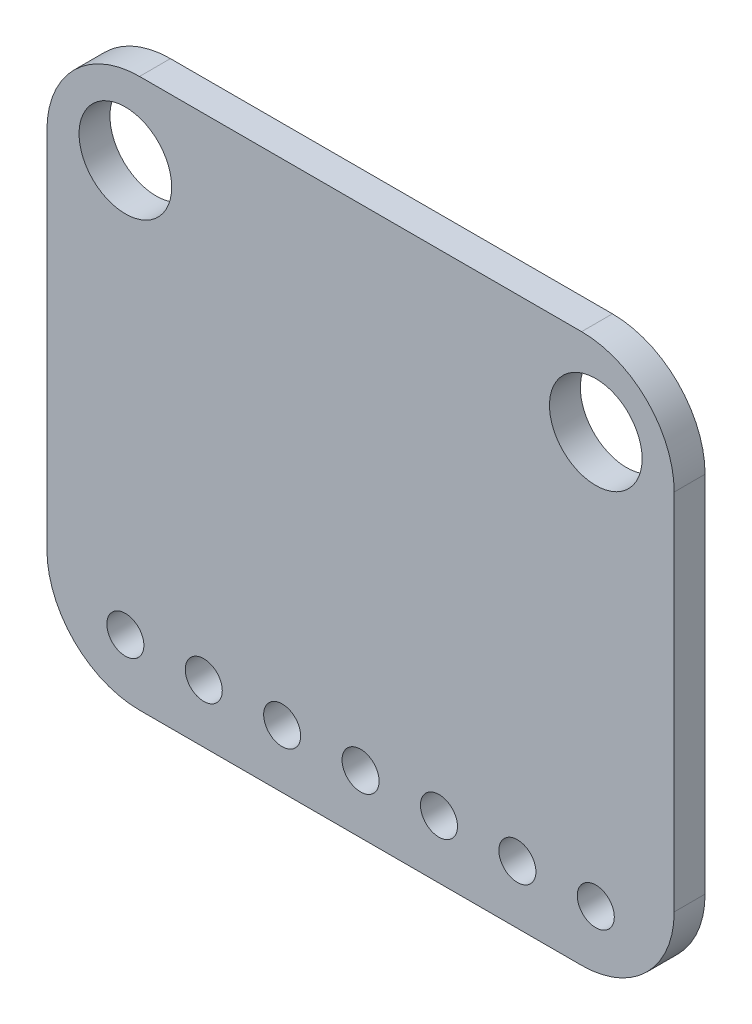
ISO-10303-21;
HEADER;
FILE_DESCRIPTION(('STEP AP214'),'2;1');
FILE_NAME('part.step','',(''),(''),'','','');
FILE_SCHEMA(('AUTOMOTIVE_DESIGN { 1 0 10303 214 1 1 1 1 }'));
ENDSEC;
DATA;
#1=APPLICATION_CONTEXT('core data for automotive mechanical design processes');
#2=APPLICATION_PROTOCOL_DEFINITION('international standard','automotive_design',2000,#1);
#3=PRODUCT_CONTEXT('',#1,'mechanical');
#4=PRODUCT('Part','Part','',(#3));
#5=PRODUCT_RELATED_PRODUCT_CATEGORY('part','',(#4));
#6=PRODUCT_DEFINITION_FORMATION('','',#4);
#7=PRODUCT_DEFINITION_CONTEXT('part definition',#1,'design');
#8=PRODUCT_DEFINITION('design','',#6,#7);
#9=PRODUCT_DEFINITION_SHAPE('','',#8);
#10=(LENGTH_UNIT() NAMED_UNIT(*) SI_UNIT(.MILLI.,.METRE.));
#11=(NAMED_UNIT(*) PLANE_ANGLE_UNIT() SI_UNIT($,.RADIAN.));
#12=(NAMED_UNIT(*) SI_UNIT($,.STERADIAN.) SOLID_ANGLE_UNIT());
#13=UNCERTAINTY_MEASURE_WITH_UNIT(LENGTH_MEASURE(1.E-05),#10,'distance_accuracy_value','');
#14=(GEOMETRIC_REPRESENTATION_CONTEXT(3) GLOBAL_UNCERTAINTY_ASSIGNED_CONTEXT((#13)) GLOBAL_UNIT_ASSIGNED_CONTEXT((#10,
#11,#12)) REPRESENTATION_CONTEXT('',''));
#15=CARTESIAN_POINT('',(0.,0.,0.));
#16=DIRECTION('',(0.,0.,1.));
#17=DIRECTION('',(1.,0.,0.));
#18=AXIS2_PLACEMENT_3D('',#15,#16,#17);
#19=CARTESIAN_POINT('',(0.,0.,0.));
#20=DIRECTION('',(0.,0.,1.));
#21=DIRECTION('',(1.,0.,0.));
#22=AXIS2_PLACEMENT_3D('',#19,#20,#21);
#23=PLANE('',#22);
#24=CARTESIAN_POINT('',(7.62,-7.00360569462077,0.));
#25=DIRECTION('',(0.,0.,1.));
#26=DIRECTION('',(1.,0.,0.));
#27=AXIS2_PLACEMENT_3D('',#24,#25,#26);
#28=CIRCLE('',#27,0.6);
#29=CARTESIAN_POINT('',(8.22,-7.00360569462077,0.));
#30=VERTEX_POINT('',#29);
#31=EDGE_CURVE('E126',#30,#30,#28,.T.);
#32=ORIENTED_EDGE('',*,*,#31,.T.);
#33=EDGE_LOOP('',(#32));
#34=FACE_BOUND('',#33,.T.);
#35=CARTESIAN_POINT('',(5.08,-7.00360569462077,0.));
#36=DIRECTION('',(0.,0.,1.));
#37=DIRECTION('',(1.,0.,0.));
#38=AXIS2_PLACEMENT_3D('',#35,#36,#37);
#39=CIRCLE('',#38,0.6);
#40=CARTESIAN_POINT('',(5.68,-7.00360569462077,0.));
#41=VERTEX_POINT('',#40);
#42=EDGE_CURVE('E154',#41,#41,#39,.T.);
#43=ORIENTED_EDGE('',*,*,#42,.T.);
#44=EDGE_LOOP('',(#43));
#45=FACE_BOUND('',#44,.T.);
#46=CARTESIAN_POINT('',(2.54,-7.00360569462077,0.));
#47=DIRECTION('',(0.,0.,1.));
#48=DIRECTION('',(1.,0.,0.));
#49=AXIS2_PLACEMENT_3D('',#46,#47,#48);
#50=CIRCLE('',#49,0.6);
#51=CARTESIAN_POINT('',(3.14,-7.00360569462077,0.));
#52=VERTEX_POINT('',#51);
#53=EDGE_CURVE('E160',#52,#52,#50,.T.);
#54=ORIENTED_EDGE('',*,*,#53,.T.);
#55=EDGE_LOOP('',(#54));
#56=FACE_BOUND('',#55,.T.);
#57=CARTESIAN_POINT('',(0.,-7.00360569462077,0.));
#58=DIRECTION('',(0.,0.,1.));
#59=DIRECTION('',(1.,0.,0.));
#60=AXIS2_PLACEMENT_3D('',#57,#58,#59);
#61=CIRCLE('',#60,0.6);
#62=CARTESIAN_POINT('',(0.600000000000002,-7.00360569462077,0.));
#63=VERTEX_POINT('',#62);
#64=EDGE_CURVE('E166',#63,#63,#61,.T.);
#65=ORIENTED_EDGE('',*,*,#64,.T.);
#66=EDGE_LOOP('',(#65));
#67=FACE_BOUND('',#66,.T.);
#68=CARTESIAN_POINT('',(-2.54,-7.00360569462077,0.));
#69=DIRECTION('',(0.,0.,1.));
#70=DIRECTION('',(1.,0.,0.));
#71=AXIS2_PLACEMENT_3D('',#68,#69,#70);
#72=CIRCLE('',#71,0.6);
#73=CARTESIAN_POINT('',(-1.94,-7.00360569462077,0.));
#74=VERTEX_POINT('',#73);
#75=EDGE_CURVE('E172',#74,#74,#72,.T.);
#76=ORIENTED_EDGE('',*,*,#75,.T.);
#77=EDGE_LOOP('',(#76));
#78=FACE_BOUND('',#77,.T.);
#79=CARTESIAN_POINT('',(-5.08,-7.00360569462077,0.));
#80=DIRECTION('',(0.,0.,1.));
#81=DIRECTION('',(1.,0.,0.));
#82=AXIS2_PLACEMENT_3D('',#79,#80,#81);
#83=CIRCLE('',#82,0.6);
#84=CARTESIAN_POINT('',(-4.48,-7.00360569462077,0.));
#85=VERTEX_POINT('',#84);
#86=EDGE_CURVE('E178',#85,#85,#83,.T.);
#87=ORIENTED_EDGE('',*,*,#86,.T.);
#88=EDGE_LOOP('',(#87));
#89=FACE_BOUND('',#88,.T.);
#90=CARTESIAN_POINT('',(-7.62,-7.00360569462077,0.));
#91=DIRECTION('',(0.,0.,1.));
#92=DIRECTION('',(1.,0.,0.));
#93=AXIS2_PLACEMENT_3D('',#90,#91,#92);
#94=CIRCLE('',#93,0.6);
#95=CARTESIAN_POINT('',(-7.02,-7.00360569462077,0.));
#96=VERTEX_POINT('',#95);
#97=EDGE_CURVE('E184',#96,#96,#94,.T.);
#98=ORIENTED_EDGE('',*,*,#97,.T.);
#99=EDGE_LOOP('',(#98));
#100=FACE_BOUND('',#99,.T.);
#101=CARTESIAN_POINT('',(7.62,6.30387527734178,0.));
#102=DIRECTION('',(0.,0.,1.));
#103=DIRECTION('',(1.,0.,0.));
#104=AXIS2_PLACEMENT_3D('',#101,#102,#103);
#105=CIRCLE('',#104,1.5);
#106=CARTESIAN_POINT('',(9.12,6.30387527734178,0.));
#107=VERTEX_POINT('',#106);
#108=EDGE_CURVE('E190',#107,#107,#105,.T.);
#109=ORIENTED_EDGE('',*,*,#108,.T.);
#110=EDGE_LOOP('',(#109));
#111=FACE_BOUND('',#110,.T.);
#112=CARTESIAN_POINT('',(-7.62,6.30387527734178,0.));
#113=DIRECTION('',(0.,0.,1.));
#114=DIRECTION('',(1.,0.,0.));
#115=AXIS2_PLACEMENT_3D('',#112,#113,#114);
#116=CIRCLE('',#115,1.5);
#117=CARTESIAN_POINT('',(-6.12,6.30387527734178,0.));
#118=VERTEX_POINT('',#117);
#119=EDGE_CURVE('E196',#118,#118,#116,.T.);
#120=ORIENTED_EDGE('',*,*,#119,.T.);
#121=EDGE_LOOP('',(#120));
#122=FACE_BOUND('',#121,.T.);
#123=DIRECTION('',(0.,1.,0.));
#124=VECTOR('',#123,1.);
#125=CARTESIAN_POINT('',(10.16,8.89000000000001,0.));
#126=LINE('',#125,#124);
#127=CARTESIAN_POINT('',(10.16,-5.88999999999999,0.));
#128=VERTEX_POINT('',#127);
#129=CARTESIAN_POINT('',(10.16,5.89000000000001,0.));
#130=VERTEX_POINT('',#129);
#131=EDGE_CURVE('E202',#128,#130,#126,.T.);
#132=ORIENTED_EDGE('',*,*,#131,.F.);
#133=CARTESIAN_POINT('',(7.16000000000001,-5.89,0.));
#134=DIRECTION('',(0.,0.,1.));
#135=DIRECTION('',(1.,0.,0.));
#136=AXIS2_PLACEMENT_3D('',#133,#134,#135);
#137=CIRCLE('',#136,3.);
#138=CARTESIAN_POINT('',(7.16000000000001,-8.89,0.));
#139=VERTEX_POINT('',#138);
#140=EDGE_CURVE('E265',#128,#139,#137,.F.);
#141=ORIENTED_EDGE('',*,*,#140,.T.);
#142=DIRECTION('',(1.,0.,0.));
#143=VECTOR('',#142,1.);
#144=CARTESIAN_POINT('',(-10.16,-8.89,0.));
#145=LINE('',#144,#143);
#146=CARTESIAN_POINT('',(-7.15999999999999,-8.89,0.));
#147=VERTEX_POINT('',#146);
#148=EDGE_CURVE('E208',#147,#139,#145,.T.);
#149=ORIENTED_EDGE('',*,*,#148,.F.);
#150=CARTESIAN_POINT('',(-7.15999999999999,-5.89,0.));
#151=DIRECTION('',(0.,0.,1.));
#152=DIRECTION('',(1.,0.,0.));
#153=AXIS2_PLACEMENT_3D('',#150,#151,#152);
#154=CIRCLE('',#153,3.);
#155=CARTESIAN_POINT('',(-10.16,-5.88999999999999,0.));
#156=VERTEX_POINT('',#155);
#157=EDGE_CURVE('E253',#147,#156,#154,.F.);
#158=ORIENTED_EDGE('',*,*,#157,.T.);
#159=DIRECTION('',(0.,-1.,0.));
#160=VECTOR('',#159,1.);
#161=CARTESIAN_POINT('',(-10.16,8.89000000000001,0.));
#162=LINE('',#161,#160);
#163=CARTESIAN_POINT('',(-10.16,5.89000000000001,0.));
#164=VERTEX_POINT('',#163);
#165=EDGE_CURVE('E222',#164,#156,#162,.T.);
#166=ORIENTED_EDGE('',*,*,#165,.F.);
#167=CARTESIAN_POINT('',(-7.15999999999999,5.89000000000001,0.));
#168=DIRECTION('',(0.,0.,1.));
#169=DIRECTION('',(1.,0.,0.));
#170=AXIS2_PLACEMENT_3D('',#167,#168,#169);
#171=CIRCLE('',#170,3.);
#172=CARTESIAN_POINT('',(-7.15999999999999,8.89000000000001,0.));
#173=VERTEX_POINT('',#172);
#174=EDGE_CURVE('E245',#164,#173,#171,.F.);
#175=ORIENTED_EDGE('',*,*,#174,.T.);
#176=DIRECTION('',(-1.,0.,0.));
#177=VECTOR('',#176,1.);
#178=CARTESIAN_POINT('',(-10.16,8.89000000000001,0.));
#179=LINE('',#178,#177);
#180=CARTESIAN_POINT('',(7.16000000000001,8.89000000000001,0.));
#181=VERTEX_POINT('',#180);
#182=EDGE_CURVE('E219',#181,#173,#179,.T.);
#183=ORIENTED_EDGE('',*,*,#182,.F.);
#184=CARTESIAN_POINT('',(7.16000000000001,5.89000000000001,0.));
#185=DIRECTION('',(0.,0.,1.));
#186=DIRECTION('',(1.,0.,0.));
#187=AXIS2_PLACEMENT_3D('',#184,#185,#186);
#188=CIRCLE('',#187,3.);
#189=EDGE_CURVE('E232',#181,#130,#188,.F.);
#190=ORIENTED_EDGE('',*,*,#189,.T.);
#191=EDGE_LOOP('',(#132,#141,#149,#158,#166,#175,#183,#190));
#192=FACE_BOUND('',#191,.T.);
#193=DIRECTION('',(0.,-1.,0.));
#194=VECTOR('',#193,1.);
#195=CARTESIAN_POINT('',(0.902074882219495,0.,0.));
#196=LINE('',#195,#194);
#197=CARTESIAN_POINT('',(0.902074882219495,4.77036531361819,0.));
#198=VERTEX_POINT('',#197);
#199=CARTESIAN_POINT('',(0.902074882219495,-1.28578560904202,0.));
#200=VERTEX_POINT('',#199);
#201=EDGE_CURVE('E11',#198,#200,#196,.T.);
#202=ORIENTED_EDGE('',*,*,#201,.F.);
#203=DIRECTION('',(1.,0.,0.));
#204=VECTOR('',#203,1.);
#205=CARTESIAN_POINT('',(0.,4.77036531361819,0.));
#206=LINE('',#205,#204);
#207=CARTESIAN_POINT('',(-2.67800211177871,4.77036531361819,0.));
#208=VERTEX_POINT('',#207);
#209=EDGE_CURVE('E43',#208,#198,#206,.T.);
#210=ORIENTED_EDGE('',*,*,#209,.F.);
#211=DIRECTION('',(0.,1.,0.));
#212=VECTOR('',#211,1.);
#213=CARTESIAN_POINT('',(-2.67800211177871,0.,0.));
#214=LINE('',#213,#212);
#215=CARTESIAN_POINT('',(-2.67800211177871,-1.28578560904202,0.));
#216=VERTEX_POINT('',#215);
#217=EDGE_CURVE('E270',#216,#208,#214,.T.);
#218=ORIENTED_EDGE('',*,*,#217,.F.);
#219=DIRECTION('',(-1.,0.,0.));
#220=VECTOR('',#219,1.);
#221=CARTESIAN_POINT('',(0.,-1.28578560904202,0.));
#222=LINE('',#221,#220);
#223=EDGE_CURVE('E267',#200,#216,#222,.T.);
#224=ORIENTED_EDGE('',*,*,#223,.F.);
#225=EDGE_LOOP('',(#202,#210,#218,#224));
#226=FACE_BOUND('',#225,.T.);
#227=ADVANCED_FACE('F35',(#34,#45,#56,#67,#78,#89,#100,#111,#122,#192,#226),#23,.F.);
#228=CARTESIAN_POINT('',(7.16000000000001,-5.89,1.));
#229=DIRECTION('',(0.,0.,-1.));
#230=DIRECTION('',(-1.,0.,0.));
#231=AXIS2_PLACEMENT_3D('',#228,#229,#230);
#232=CYLINDRICAL_SURFACE('',#231,3.);
#233=DIRECTION('',(0.,0.,-1.));
#234=VECTOR('',#233,1.);
#235=CARTESIAN_POINT('',(10.16,-5.89,1.));
#236=LINE('',#235,#234);
#237=CARTESIAN_POINT('',(10.16,-5.88999999999999,1.));
#238=VERTEX_POINT('',#237);
#239=EDGE_CURVE('E257',#238,#128,#236,.T.);
#240=ORIENTED_EDGE('',*,*,#239,.F.);
#241=CARTESIAN_POINT('',(7.16000000000001,-5.89,1.));
#242=DIRECTION('',(0.,0.,1.));
#243=DIRECTION('',(1.,0.,0.));
#244=AXIS2_PLACEMENT_3D('',#241,#242,#243);
#245=CIRCLE('',#244,3.);
#246=CARTESIAN_POINT('',(7.16000000000001,-8.89,1.));
#247=VERTEX_POINT('',#246);
#248=EDGE_CURVE('E263',#247,#238,#245,.T.);
#249=ORIENTED_EDGE('',*,*,#248,.F.);
#250=DIRECTION('',(0.,0.,-1.));
#251=VECTOR('',#250,1.);
#252=CARTESIAN_POINT('',(7.16000000000001,-8.89,1.));
#253=LINE('',#252,#251);
#254=EDGE_CURVE('E260',#139,#247,#253,.F.);
#255=ORIENTED_EDGE('',*,*,#254,.F.);
#256=ORIENTED_EDGE('',*,*,#140,.F.);
#257=EDGE_LOOP('',(#240,#249,#255,#256));
#258=FACE_BOUND('',#257,.T.);
#259=ADVANCED_FACE('F37',(#258),#232,.T.);
#260=CARTESIAN_POINT('',(-7.15999999999999,-5.89,1.));
#261=DIRECTION('',(0.,0.,1.));
#262=DIRECTION('',(1.,0.,0.));
#263=AXIS2_PLACEMENT_3D('',#260,#261,#262);
#264=CYLINDRICAL_SURFACE('',#263,3.);
#265=DIRECTION('',(0.,0.,1.));
#266=VECTOR('',#265,1.);
#267=CARTESIAN_POINT('',(-10.16,-5.89,1.));
#268=LINE('',#267,#266);
#269=CARTESIAN_POINT('',(-10.16,-5.88999999999999,1.));
#270=VERTEX_POINT('',#269);
#271=EDGE_CURVE('E247',#156,#270,#268,.T.);
#272=ORIENTED_EDGE('',*,*,#271,.F.);
#273=ORIENTED_EDGE('',*,*,#157,.F.);
#274=DIRECTION('',(0.,0.,1.));
#275=VECTOR('',#274,1.);
#276=CARTESIAN_POINT('',(-7.15999999999999,-8.89,1.));
#277=LINE('',#276,#275);
#278=CARTESIAN_POINT('',(-7.15999999999999,-8.89,1.));
#279=VERTEX_POINT('',#278);
#280=EDGE_CURVE('E250',#279,#147,#277,.F.);
#281=ORIENTED_EDGE('',*,*,#280,.F.);
#282=CARTESIAN_POINT('',(-7.15999999999999,-5.89,1.));
#283=DIRECTION('',(0.,0.,1.));
#284=DIRECTION('',(1.,0.,0.));
#285=AXIS2_PLACEMENT_3D('',#282,#283,#284);
#286=CIRCLE('',#285,3.);
#287=EDGE_CURVE('E255',#270,#279,#286,.T.);
#288=ORIENTED_EDGE('',*,*,#287,.F.);
#289=EDGE_LOOP('',(#272,#273,#281,#288));
#290=FACE_BOUND('',#289,.T.);
#291=ADVANCED_FACE('F290',(#290),#264,.T.);
#292=CARTESIAN_POINT('',(-7.15999999999999,5.89000000000001,1.));
#293=DIRECTION('',(0.,0.,-1.));
#294=DIRECTION('',(-1.,0.,0.));
#295=AXIS2_PLACEMENT_3D('',#292,#293,#294);
#296=CYLINDRICAL_SURFACE('',#295,3.);
#297=DIRECTION('',(0.,0.,-1.));
#298=VECTOR('',#297,1.);
#299=CARTESIAN_POINT('',(-10.16,5.89000000000001,1.));
#300=LINE('',#299,#298);
#301=CARTESIAN_POINT('',(-10.16,5.89000000000001,1.));
#302=VERTEX_POINT('',#301);
#303=EDGE_CURVE('E237',#302,#164,#300,.T.);
#304=ORIENTED_EDGE('',*,*,#303,.F.);
#305=CARTESIAN_POINT('',(-7.15999999999999,5.89000000000001,1.));
#306=DIRECTION('',(0.,0.,1.));
#307=DIRECTION('',(1.,0.,0.));
#308=AXIS2_PLACEMENT_3D('',#305,#306,#307);
#309=CIRCLE('',#308,3.);
#310=CARTESIAN_POINT('',(-7.15999999999999,8.89000000000001,1.));
#311=VERTEX_POINT('',#310);
#312=EDGE_CURVE('E243',#311,#302,#309,.T.);
#313=ORIENTED_EDGE('',*,*,#312,.F.);
#314=DIRECTION('',(0.,0.,-1.));
#315=VECTOR('',#314,1.);
#316=CARTESIAN_POINT('',(-7.15999999999999,8.89000000000001,1.));
#317=LINE('',#316,#315);
#318=EDGE_CURVE('E240',#173,#311,#317,.F.);
#319=ORIENTED_EDGE('',*,*,#318,.F.);
#320=ORIENTED_EDGE('',*,*,#174,.F.);
#321=EDGE_LOOP('',(#304,#313,#319,#320));
#322=FACE_BOUND('',#321,.T.);
#323=ADVANCED_FACE('F317',(#322),#296,.T.);
#324=CARTESIAN_POINT('',(7.16000000000001,5.89000000000001,1.));
#325=DIRECTION('',(0.,0.,1.));
#326=DIRECTION('',(1.,0.,0.));
#327=AXIS2_PLACEMENT_3D('',#324,#325,#326);
#328=CYLINDRICAL_SURFACE('',#327,3.);
#329=DIRECTION('',(0.,0.,1.));
#330=VECTOR('',#329,1.);
#331=CARTESIAN_POINT('',(10.16,5.89000000000001,1.));
#332=LINE('',#331,#330);
#333=CARTESIAN_POINT('',(10.16,5.89000000000001,1.));
#334=VERTEX_POINT('',#333);
#335=EDGE_CURVE('E217',#130,#334,#332,.T.);
#336=ORIENTED_EDGE('',*,*,#335,.F.);
#337=ORIENTED_EDGE('',*,*,#189,.F.);
#338=DIRECTION('',(0.,0.,1.));
#339=VECTOR('',#338,1.);
#340=CARTESIAN_POINT('',(7.16000000000001,8.89000000000001,1.));
#341=LINE('',#340,#339);
#342=CARTESIAN_POINT('',(7.16000000000001,8.89000000000001,1.));
#343=VERTEX_POINT('',#342);
#344=EDGE_CURVE('E229',#343,#181,#341,.F.);
#345=ORIENTED_EDGE('',*,*,#344,.F.);
#346=CARTESIAN_POINT('',(7.16000000000001,5.89000000000001,1.));
#347=DIRECTION('',(0.,0.,1.));
#348=DIRECTION('',(1.,0.,0.));
#349=AXIS2_PLACEMENT_3D('',#346,#347,#348);
#350=CIRCLE('',#349,3.);
#351=EDGE_CURVE('E235',#334,#343,#350,.T.);
#352=ORIENTED_EDGE('',*,*,#351,.F.);
#353=EDGE_LOOP('',(#336,#337,#345,#352));
#354=FACE_BOUND('',#353,.T.);
#355=ADVANCED_FACE('F314',(#354),#328,.T.);
#356=CARTESIAN_POINT('',(0.,0.,1.));
#357=DIRECTION('',(0.,0.,1.));
#358=DIRECTION('',(1.,0.,0.));
#359=AXIS2_PLACEMENT_3D('',#356,#357,#358);
#360=PLANE('',#359);
#361=CARTESIAN_POINT('',(5.08,-7.00360569462077,1.));
#362=DIRECTION('',(0.,0.,1.));
#363=DIRECTION('',(1.,0.,0.));
#364=AXIS2_PLACEMENT_3D('',#361,#362,#363);
#365=CIRCLE('',#364,0.6);
#366=CARTESIAN_POINT('',(5.68,-7.00360569462077,1.));
#367=VERTEX_POINT('',#366);
#368=EDGE_CURVE('E157',#367,#367,#365,.T.);
#369=ORIENTED_EDGE('',*,*,#368,.F.);
#370=EDGE_LOOP('',(#369));
#371=FACE_BOUND('',#370,.T.);
#372=CARTESIAN_POINT('',(0.,-7.00360569462077,1.));
#373=DIRECTION('',(0.,0.,1.));
#374=DIRECTION('',(1.,0.,0.));
#375=AXIS2_PLACEMENT_3D('',#372,#373,#374);
#376=CIRCLE('',#375,0.6);
#377=CARTESIAN_POINT('',(0.600000000000002,-7.00360569462077,1.));
#378=VERTEX_POINT('',#377);
#379=EDGE_CURVE('E169',#378,#378,#376,.T.);
#380=ORIENTED_EDGE('',*,*,#379,.F.);
#381=EDGE_LOOP('',(#380));
#382=FACE_BOUND('',#381,.T.);
#383=CARTESIAN_POINT('',(-5.08,-7.00360569462077,1.));
#384=DIRECTION('',(0.,0.,1.));
#385=DIRECTION('',(1.,0.,0.));
#386=AXIS2_PLACEMENT_3D('',#383,#384,#385);
#387=CIRCLE('',#386,0.6);
#388=CARTESIAN_POINT('',(-4.48,-7.00360569462077,1.));
#389=VERTEX_POINT('',#388);
#390=EDGE_CURVE('E181',#389,#389,#387,.T.);
#391=ORIENTED_EDGE('',*,*,#390,.F.);
#392=EDGE_LOOP('',(#391));
#393=FACE_BOUND('',#392,.T.);
#394=CARTESIAN_POINT('',(7.62,6.30387527734178,1.));
#395=DIRECTION('',(0.,0.,1.));
#396=DIRECTION('',(1.,0.,0.));
#397=AXIS2_PLACEMENT_3D('',#394,#395,#396);
#398=CIRCLE('',#397,1.5);
#399=CARTESIAN_POINT('',(9.12,6.30387527734178,1.));
#400=VERTEX_POINT('',#399);
#401=EDGE_CURVE('E193',#400,#400,#398,.T.);
#402=ORIENTED_EDGE('',*,*,#401,.F.);
#403=EDGE_LOOP('',(#402));
#404=FACE_BOUND('',#403,.T.);
#405=DIRECTION('',(1.,0.,0.));
#406=VECTOR('',#405,1.);
#407=CARTESIAN_POINT('',(-10.16,-8.89,1.));
#408=LINE('',#407,#406);
#409=EDGE_CURVE('E214',#279,#247,#408,.T.);
#410=ORIENTED_EDGE('',*,*,#409,.T.);
#411=ORIENTED_EDGE('',*,*,#248,.T.);
#412=DIRECTION('',(0.,1.,0.));
#413=VECTOR('',#412,1.);
#414=CARTESIAN_POINT('',(10.16,8.89000000000001,1.));
#415=LINE('',#414,#413);
#416=EDGE_CURVE('E205',#238,#334,#415,.T.);
#417=ORIENTED_EDGE('',*,*,#416,.T.);
#418=ORIENTED_EDGE('',*,*,#351,.T.);
#419=DIRECTION('',(-1.,0.,0.));
#420=VECTOR('',#419,1.);
#421=CARTESIAN_POINT('',(-10.16,8.89000000000001,1.));
#422=LINE('',#421,#420);
#423=EDGE_CURVE('E207',#343,#311,#422,.T.);
#424=ORIENTED_EDGE('',*,*,#423,.T.);
#425=ORIENTED_EDGE('',*,*,#312,.T.);
#426=DIRECTION('',(0.,-1.,0.));
#427=VECTOR('',#426,1.);
#428=CARTESIAN_POINT('',(-10.16,8.89000000000001,1.));
#429=LINE('',#428,#427);
#430=EDGE_CURVE('E211',#302,#270,#429,.T.);
#431=ORIENTED_EDGE('',*,*,#430,.T.);
#432=ORIENTED_EDGE('',*,*,#287,.T.);
#433=EDGE_LOOP('',(#410,#411,#417,#418,#424,#425,#431,#432));
#434=FACE_BOUND('',#433,.T.);
#435=CARTESIAN_POINT('',(-7.62,6.30387527734178,1.));
#436=DIRECTION('',(0.,0.,1.));
#437=DIRECTION('',(1.,0.,0.));
#438=AXIS2_PLACEMENT_3D('',#435,#436,#437);
#439=CIRCLE('',#438,1.5);
#440=CARTESIAN_POINT('',(-6.12,6.30387527734178,1.));
#441=VERTEX_POINT('',#440);
#442=EDGE_CURVE('E199',#441,#441,#439,.T.);
#443=ORIENTED_EDGE('',*,*,#442,.F.);
#444=EDGE_LOOP('',(#443));
#445=FACE_BOUND('',#444,.T.);
#446=CARTESIAN_POINT('',(-7.62,-7.00360569462077,1.));
#447=DIRECTION('',(0.,0.,1.));
#448=DIRECTION('',(1.,0.,0.));
#449=AXIS2_PLACEMENT_3D('',#446,#447,#448);
#450=CIRCLE('',#449,0.6);
#451=CARTESIAN_POINT('',(-7.02,-7.00360569462077,1.));
#452=VERTEX_POINT('',#451);
#453=EDGE_CURVE('E187',#452,#452,#450,.T.);
#454=ORIENTED_EDGE('',*,*,#453,.F.);
#455=EDGE_LOOP('',(#454));
#456=FACE_BOUND('',#455,.T.);
#457=CARTESIAN_POINT('',(-2.54,-7.00360569462077,1.));
#458=DIRECTION('',(0.,0.,1.));
#459=DIRECTION('',(1.,0.,0.));
#460=AXIS2_PLACEMENT_3D('',#457,#458,#459);
#461=CIRCLE('',#460,0.6);
#462=CARTESIAN_POINT('',(-1.94,-7.00360569462077,1.));
#463=VERTEX_POINT('',#462);
#464=EDGE_CURVE('E175',#463,#463,#461,.T.);
#465=ORIENTED_EDGE('',*,*,#464,.F.);
#466=EDGE_LOOP('',(#465));
#467=FACE_BOUND('',#466,.T.);
#468=CARTESIAN_POINT('',(2.54,-7.00360569462077,1.));
#469=DIRECTION('',(0.,0.,1.));
#470=DIRECTION('',(1.,0.,0.));
#471=AXIS2_PLACEMENT_3D('',#468,#469,#470);
#472=CIRCLE('',#471,0.6);
#473=CARTESIAN_POINT('',(3.14,-7.00360569462077,1.));
#474=VERTEX_POINT('',#473);
#475=EDGE_CURVE('E163',#474,#474,#472,.T.);
#476=ORIENTED_EDGE('',*,*,#475,.F.);
#477=EDGE_LOOP('',(#476));
#478=FACE_BOUND('',#477,.T.);
#479=CARTESIAN_POINT('',(7.62,-7.00360569462077,1.));
#480=DIRECTION('',(0.,0.,1.));
#481=DIRECTION('',(1.,0.,0.));
#482=AXIS2_PLACEMENT_3D('',#479,#480,#481);
#483=CIRCLE('',#482,0.6);
#484=CARTESIAN_POINT('',(8.22,-7.00360569462077,1.));
#485=VERTEX_POINT('',#484);
#486=EDGE_CURVE('E151',#485,#485,#483,.T.);
#487=ORIENTED_EDGE('',*,*,#486,.F.);
#488=EDGE_LOOP('',(#487));
#489=FACE_BOUND('',#488,.T.);
#490=ADVANCED_FACE('F295',(#371,#382,#393,#404,#434,#445,#456,#467,#478,#489),#360,.T.);
#491=CARTESIAN_POINT('',(10.16,8.89000000000001,1.));
#492=DIRECTION('',(-1.,0.,0.));
#493=DIRECTION('',(0.,-1.,0.));
#494=AXIS2_PLACEMENT_3D('',#491,#492,#493);
#495=PLANE('',#494);
#496=ORIENTED_EDGE('',*,*,#416,.F.);
#497=ORIENTED_EDGE('',*,*,#239,.T.);
#498=ORIENTED_EDGE('',*,*,#131,.T.);
#499=ORIENTED_EDGE('',*,*,#335,.T.);
#500=EDGE_LOOP('',(#496,#497,#498,#499));
#501=FACE_BOUND('',#500,.T.);
#502=ADVANCED_FACE('F309',(#501),#495,.F.);
#503=CARTESIAN_POINT('',(-10.16,8.89000000000001,1.));
#504=DIRECTION('',(0.,-1.,0.));
#505=DIRECTION('',(0.,0.,-1.));
#506=AXIS2_PLACEMENT_3D('',#503,#504,#505);
#507=PLANE('',#506);
#508=ORIENTED_EDGE('',*,*,#182,.T.);
#509=ORIENTED_EDGE('',*,*,#318,.T.);
#510=ORIENTED_EDGE('',*,*,#423,.F.);
#511=ORIENTED_EDGE('',*,*,#344,.T.);
#512=EDGE_LOOP('',(#508,#509,#510,#511));
#513=FACE_BOUND('',#512,.T.);
#514=ADVANCED_FACE('F305',(#513),#507,.F.);
#515=CARTESIAN_POINT('',(-10.16,8.89000000000001,1.));
#516=DIRECTION('',(1.,0.,0.));
#517=DIRECTION('',(0.,1.,0.));
#518=AXIS2_PLACEMENT_3D('',#515,#516,#517);
#519=PLANE('',#518);
#520=ORIENTED_EDGE('',*,*,#165,.T.);
#521=ORIENTED_EDGE('',*,*,#271,.T.);
#522=ORIENTED_EDGE('',*,*,#430,.F.);
#523=ORIENTED_EDGE('',*,*,#303,.T.);
#524=EDGE_LOOP('',(#520,#521,#522,#523));
#525=FACE_BOUND('',#524,.T.);
#526=ADVANCED_FACE('F301',(#525),#519,.F.);
#527=CARTESIAN_POINT('',(-10.16,-8.89,1.));
#528=DIRECTION('',(0.,1.,0.));
#529=DIRECTION('',(0.,0.,1.));
#530=AXIS2_PLACEMENT_3D('',#527,#528,#529);
#531=PLANE('',#530);
#532=ORIENTED_EDGE('',*,*,#148,.T.);
#533=ORIENTED_EDGE('',*,*,#254,.T.);
#534=ORIENTED_EDGE('',*,*,#409,.F.);
#535=ORIENTED_EDGE('',*,*,#280,.T.);
#536=EDGE_LOOP('',(#532,#533,#534,#535));
#537=FACE_BOUND('',#536,.T.);
#538=ADVANCED_FACE('F297',(#537),#531,.F.);
#539=CARTESIAN_POINT('',(-7.62,6.30387527734178,1.));
#540=DIRECTION('',(0.,0.,-1.));
#541=DIRECTION('',(-1.,0.,0.));
#542=AXIS2_PLACEMENT_3D('',#539,#540,#541);
#543=CYLINDRICAL_SURFACE('',#542,1.5);
#544=ORIENTED_EDGE('',*,*,#442,.T.);
#545=EDGE_LOOP('',(#544));
#546=FACE_BOUND('',#545,.T.);
#547=ORIENTED_EDGE('',*,*,#119,.F.);
#548=EDGE_LOOP('',(#547));
#549=FACE_BOUND('',#548,.T.);
#550=ADVANCED_FACE('F300',(#546,#549),#543,.F.);
#551=CARTESIAN_POINT('',(7.62,6.30387527734178,1.));
#552=DIRECTION('',(0.,0.,-1.));
#553=DIRECTION('',(-1.,0.,0.));
#554=AXIS2_PLACEMENT_3D('',#551,#552,#553);
#555=CYLINDRICAL_SURFACE('',#554,1.5);
#556=ORIENTED_EDGE('',*,*,#401,.T.);
#557=EDGE_LOOP('',(#556));
#558=FACE_BOUND('',#557,.T.);
#559=ORIENTED_EDGE('',*,*,#108,.F.);
#560=EDGE_LOOP('',(#559));
#561=FACE_BOUND('',#560,.T.);
#562=ADVANCED_FACE('F391',(#558,#561),#555,.F.);
#563=CARTESIAN_POINT('',(-7.62,-7.00360569462077,1.));
#564=DIRECTION('',(0.,0.,-1.));
#565=DIRECTION('',(-1.,0.,0.));
#566=AXIS2_PLACEMENT_3D('',#563,#564,#565);
#567=CYLINDRICAL_SURFACE('',#566,0.6);
#568=ORIENTED_EDGE('',*,*,#453,.T.);
#569=EDGE_LOOP('',(#568));
#570=FACE_BOUND('',#569,.T.);
#571=ORIENTED_EDGE('',*,*,#97,.F.);
#572=EDGE_LOOP('',(#571));
#573=FACE_BOUND('',#572,.T.);
#574=ADVANCED_FACE('F387',(#570,#573),#567,.F.);
#575=CARTESIAN_POINT('',(-5.08,-7.00360569462077,1.));
#576=DIRECTION('',(0.,0.,-1.));
#577=DIRECTION('',(-1.,0.,0.));
#578=AXIS2_PLACEMENT_3D('',#575,#576,#577);
#579=CYLINDRICAL_SURFACE('',#578,0.6);
#580=ORIENTED_EDGE('',*,*,#390,.T.);
#581=EDGE_LOOP('',(#580));
#582=FACE_BOUND('',#581,.T.);
#583=ORIENTED_EDGE('',*,*,#86,.F.);
#584=EDGE_LOOP('',(#583));
#585=FACE_BOUND('',#584,.T.);
#586=ADVANCED_FACE('F383',(#582,#585),#579,.F.);
#587=CARTESIAN_POINT('',(-2.54,-7.00360569462077,1.));
#588=DIRECTION('',(0.,0.,-1.));
#589=DIRECTION('',(-1.,0.,0.));
#590=AXIS2_PLACEMENT_3D('',#587,#588,#589);
#591=CYLINDRICAL_SURFACE('',#590,0.6);
#592=ORIENTED_EDGE('',*,*,#464,.T.);
#593=EDGE_LOOP('',(#592));
#594=FACE_BOUND('',#593,.T.);
#595=ORIENTED_EDGE('',*,*,#75,.F.);
#596=EDGE_LOOP('',(#595));
#597=FACE_BOUND('',#596,.T.);
#598=ADVANCED_FACE('F379',(#594,#597),#591,.F.);
#599=CARTESIAN_POINT('',(0.,-7.00360569462077,1.));
#600=DIRECTION('',(0.,0.,-1.));
#601=DIRECTION('',(-1.,0.,0.));
#602=AXIS2_PLACEMENT_3D('',#599,#600,#601);
#603=CYLINDRICAL_SURFACE('',#602,0.6);
#604=ORIENTED_EDGE('',*,*,#379,.T.);
#605=EDGE_LOOP('',(#604));
#606=FACE_BOUND('',#605,.T.);
#607=ORIENTED_EDGE('',*,*,#64,.F.);
#608=EDGE_LOOP('',(#607));
#609=FACE_BOUND('',#608,.T.);
#610=ADVANCED_FACE('F375',(#606,#609),#603,.F.);
#611=CARTESIAN_POINT('',(2.54,-7.00360569462077,1.));
#612=DIRECTION('',(0.,0.,-1.));
#613=DIRECTION('',(-1.,0.,0.));
#614=AXIS2_PLACEMENT_3D('',#611,#612,#613);
#615=CYLINDRICAL_SURFACE('',#614,0.6);
#616=ORIENTED_EDGE('',*,*,#475,.T.);
#617=EDGE_LOOP('',(#616));
#618=FACE_BOUND('',#617,.T.);
#619=ORIENTED_EDGE('',*,*,#53,.F.);
#620=EDGE_LOOP('',(#619));
#621=FACE_BOUND('',#620,.T.);
#622=ADVANCED_FACE('F368',(#618,#621),#615,.F.);
#623=CARTESIAN_POINT('',(5.08,-7.00360569462077,1.));
#624=DIRECTION('',(0.,0.,-1.));
#625=DIRECTION('',(-1.,0.,0.));
#626=AXIS2_PLACEMENT_3D('',#623,#624,#625);
#627=CYLINDRICAL_SURFACE('',#626,0.6);
#628=ORIENTED_EDGE('',*,*,#368,.T.);
#629=EDGE_LOOP('',(#628));
#630=FACE_BOUND('',#629,.T.);
#631=ORIENTED_EDGE('',*,*,#42,.F.);
#632=EDGE_LOOP('',(#631));
#633=FACE_BOUND('',#632,.T.);
#634=ADVANCED_FACE('F360',(#630,#633),#627,.F.);
#635=CARTESIAN_POINT('',(7.62,-7.00360569462077,1.));
#636=DIRECTION('',(0.,0.,-1.));
#637=DIRECTION('',(-1.,0.,0.));
#638=AXIS2_PLACEMENT_3D('',#635,#636,#637);
#639=CYLINDRICAL_SURFACE('',#638,0.6);
#640=ORIENTED_EDGE('',*,*,#486,.T.);
#641=EDGE_LOOP('',(#640));
#642=FACE_BOUND('',#641,.T.);
#643=ORIENTED_EDGE('',*,*,#31,.F.);
#644=EDGE_LOOP('',(#643));
#645=FACE_BOUND('',#644,.T.);
#646=ADVANCED_FACE('F357',(#642,#645),#639,.F.);
#647=CARTESIAN_POINT('',(0.902074882219495,4.77036531361819,1.));
#648=DIRECTION('',(-1.,0.,0.));
#649=DIRECTION('',(0.,0.,1.));
#650=AXIS2_PLACEMENT_3D('',#647,#648,#649);
#651=PLANE('',#650);
#652=DIRECTION('',(0.,0.,-1.));
#653=VECTOR('',#652,1.);
#654=CARTESIAN_POINT('',(0.902074882219495,4.77036531361819,1.));
#655=LINE('',#654,#653);
#656=CARTESIAN_POINT('',(0.902074882219495,4.77036531361819,-1.));
#657=VERTEX_POINT('',#656);
#658=EDGE_CURVE('E119',#198,#657,#655,.T.);
#659=ORIENTED_EDGE('',*,*,#658,.F.);
#660=ORIENTED_EDGE('',*,*,#201,.T.);
#661=DIRECTION('',(0.,0.,-1.));
#662=VECTOR('',#661,1.);
#663=CARTESIAN_POINT('',(0.902074882219495,-1.28578560904202,1.));
#664=LINE('',#663,#662);
#665=CARTESIAN_POINT('',(0.902074882219495,-1.28578560904202,-1.));
#666=VERTEX_POINT('',#665);
#667=EDGE_CURVE('E141',#200,#666,#664,.T.);
#668=ORIENTED_EDGE('',*,*,#667,.T.);
#669=DIRECTION('',(0.,1.,0.));
#670=VECTOR('',#669,1.);
#671=CARTESIAN_POINT('',(0.902074882219495,4.77036531361819,-1.));
#672=LINE('',#671,#670);
#673=EDGE_CURVE('E134',#666,#657,#672,.T.);
#674=ORIENTED_EDGE('',*,*,#673,.T.);
#675=EDGE_LOOP('',(#659,#660,#668,#674));
#676=FACE_BOUND('',#675,.T.);
#677=ADVANCED_FACE('F139',(#676),#651,.F.);
#678=CARTESIAN_POINT('',(-2.67800211177871,4.77036531361819,1.));
#679=DIRECTION('',(0.,-1.,0.));
#680=DIRECTION('',(0.,0.,-1.));
#681=AXIS2_PLACEMENT_3D('',#678,#679,#680);
#682=PLANE('',#681);
#683=DIRECTION('',(0.,0.,-1.));
#684=VECTOR('',#683,1.);
#685=CARTESIAN_POINT('',(-2.67800211177871,4.77036531361819,1.));
#686=LINE('',#685,#684);
#687=CARTESIAN_POINT('',(-2.67800211177871,4.77036531361819,-1.));
#688=VERTEX_POINT('',#687);
#689=EDGE_CURVE('E127',#208,#688,#686,.T.);
#690=ORIENTED_EDGE('',*,*,#689,.F.);
#691=ORIENTED_EDGE('',*,*,#209,.T.);
#692=ORIENTED_EDGE('',*,*,#658,.T.);
#693=DIRECTION('',(-1.,0.,0.));
#694=VECTOR('',#693,1.);
#695=CARTESIAN_POINT('',(-2.67800211177871,4.77036531361819,-1.));
#696=LINE('',#695,#694);
#697=EDGE_CURVE('E123',#657,#688,#696,.T.);
#698=ORIENTED_EDGE('',*,*,#697,.T.);
#699=EDGE_LOOP('',(#690,#691,#692,#698));
#700=FACE_BOUND('',#699,.T.);
#701=ADVANCED_FACE('F122',(#700),#682,.F.);
#702=CARTESIAN_POINT('',(-2.67800211177871,4.77036531361819,1.));
#703=DIRECTION('',(1.,0.,0.));
#704=DIRECTION('',(0.,0.,-1.));
#705=AXIS2_PLACEMENT_3D('',#702,#703,#704);
#706=PLANE('',#705);
#707=DIRECTION('',(0.,0.,-1.));
#708=VECTOR('',#707,1.);
#709=CARTESIAN_POINT('',(-2.67800211177871,-1.28578560904202,1.));
#710=LINE('',#709,#708);
#711=CARTESIAN_POINT('',(-2.67800211177871,-1.28578560904202,-1.));
#712=VERTEX_POINT('',#711);
#713=EDGE_CURVE('E148',#216,#712,#710,.T.);
#714=ORIENTED_EDGE('',*,*,#713,.F.);
#715=ORIENTED_EDGE('',*,*,#217,.T.);
#716=ORIENTED_EDGE('',*,*,#689,.T.);
#717=DIRECTION('',(0.,-1.,0.));
#718=VECTOR('',#717,1.);
#719=CARTESIAN_POINT('',(-2.67800211177871,4.77036531361819,-1.));
#720=LINE('',#719,#718);
#721=EDGE_CURVE('E137',#688,#712,#720,.T.);
#722=ORIENTED_EDGE('',*,*,#721,.T.);
#723=EDGE_LOOP('',(#714,#715,#716,#722));
#724=FACE_BOUND('',#723,.T.);
#725=ADVANCED_FACE('F273',(#724),#706,.F.);
#726=CARTESIAN_POINT('',(-2.67800211177871,-1.28578560904202,1.));
#727=DIRECTION('',(0.,1.,0.));
#728=DIRECTION('',(0.,0.,1.));
#729=AXIS2_PLACEMENT_3D('',#726,#727,#728);
#730=PLANE('',#729);
#731=ORIENTED_EDGE('',*,*,#667,.F.);
#732=ORIENTED_EDGE('',*,*,#223,.T.);
#733=ORIENTED_EDGE('',*,*,#713,.T.);
#734=DIRECTION('',(1.,0.,0.));
#735=VECTOR('',#734,1.);
#736=CARTESIAN_POINT('',(-2.67800211177871,-1.28578560904202,-1.));
#737=LINE('',#736,#735);
#738=EDGE_CURVE('E145',#712,#666,#737,.T.);
#739=ORIENTED_EDGE('',*,*,#738,.T.);
#740=EDGE_LOOP('',(#731,#732,#733,#739));
#741=FACE_BOUND('',#740,.T.);
#742=ADVANCED_FACE('F275',(#741),#730,.F.);
#743=CARTESIAN_POINT('',(0.,0.,-1.));
#744=DIRECTION('',(0.,0.,1.));
#745=DIRECTION('',(1.,0.,0.));
#746=AXIS2_PLACEMENT_3D('',#743,#744,#745);
#747=PLANE('',#746);
#748=ORIENTED_EDGE('',*,*,#673,.F.);
#749=ORIENTED_EDGE('',*,*,#738,.F.);
#750=ORIENTED_EDGE('',*,*,#721,.F.);
#751=ORIENTED_EDGE('',*,*,#697,.F.);
#752=EDGE_LOOP('',(#748,#749,#750,#751));
#753=FACE_BOUND('',#752,.T.);
#754=ADVANCED_FACE('F132',(#753),#747,.F.);
#755=CLOSED_SHELL('',(#227,#259,#291,#323,#355,#490,#502,#514,#526,#538,#550,#562,#574,#586,
#598,#610,#622,#634,#646,#677,#701,#725,#742,#754));
#756=MANIFOLD_SOLID_BREP('B2',#755);
#757=ADVANCED_BREP_SHAPE_REPRESENTATION('',(#18,#756),#14);
#758=SHAPE_DEFINITION_REPRESENTATION(#9,#757);
ENDSEC;
END-ISO-10303-21;
